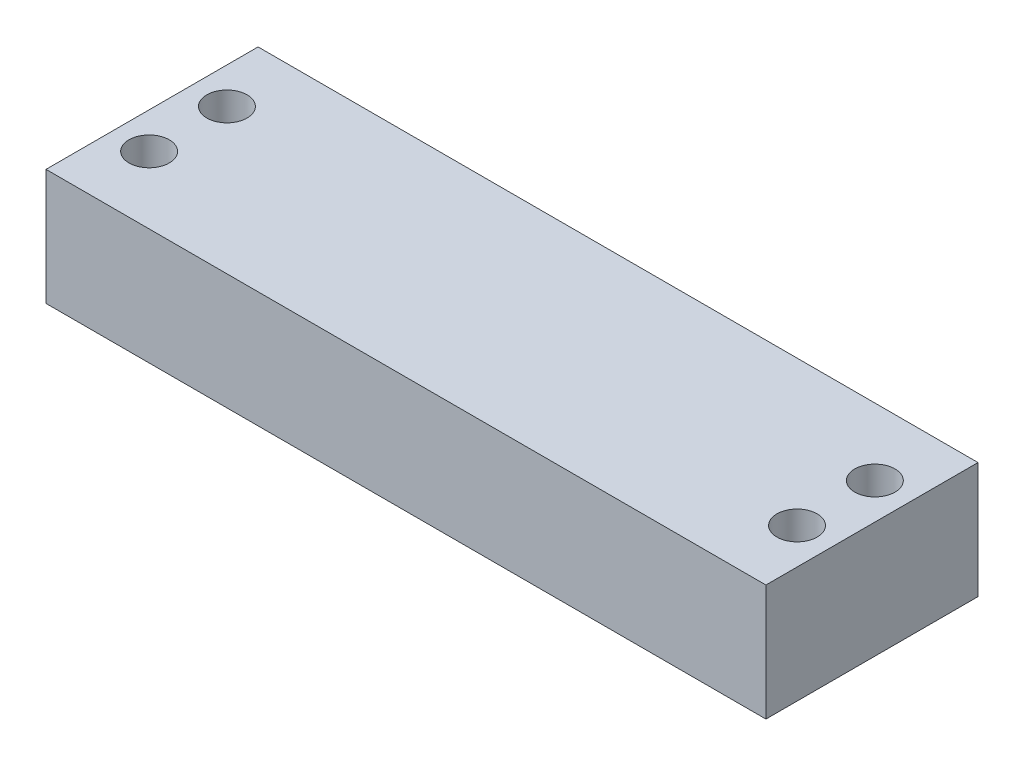
ISO-10303-21;
HEADER;
FILE_DESCRIPTION(('STEP AP214'),'2;1');
FILE_NAME('part.step','',(''),(''),'','','');
FILE_SCHEMA(('AUTOMOTIVE_DESIGN { 1 0 10303 214 1 1 1 1 }'));
ENDSEC;
DATA;
#1=APPLICATION_CONTEXT('core data for automotive mechanical design processes');
#2=APPLICATION_PROTOCOL_DEFINITION('international standard','automotive_design',2000,#1);
#3=PRODUCT_CONTEXT('',#1,'mechanical');
#4=PRODUCT('Part','Part','',(#3));
#5=PRODUCT_RELATED_PRODUCT_CATEGORY('part','',(#4));
#6=PRODUCT_DEFINITION_FORMATION('','',#4);
#7=PRODUCT_DEFINITION_CONTEXT('part definition',#1,'design');
#8=PRODUCT_DEFINITION('design','',#6,#7);
#9=PRODUCT_DEFINITION_SHAPE('','',#8);
#10=(LENGTH_UNIT() NAMED_UNIT(*) SI_UNIT(.MILLI.,.METRE.));
#11=(NAMED_UNIT(*) PLANE_ANGLE_UNIT() SI_UNIT($,.RADIAN.));
#12=(NAMED_UNIT(*) SI_UNIT($,.STERADIAN.) SOLID_ANGLE_UNIT());
#13=UNCERTAINTY_MEASURE_WITH_UNIT(LENGTH_MEASURE(1.E-05),#10,'distance_accuracy_value','');
#14=(GEOMETRIC_REPRESENTATION_CONTEXT(3) GLOBAL_UNCERTAINTY_ASSIGNED_CONTEXT((#13)) GLOBAL_UNIT_ASSIGNED_CONTEXT((#10,
#11,#12)) REPRESENTATION_CONTEXT('',''));
#15=CARTESIAN_POINT('',(0.,0.,0.));
#16=DIRECTION('',(0.,0.,1.));
#17=DIRECTION('',(1.,0.,0.));
#18=AXIS2_PLACEMENT_3D('',#15,#16,#17);
#19=CARTESIAN_POINT('',(0.,11.938,0.));
#20=DIRECTION('',(0.,-1.,0.));
#21=DIRECTION('',(0.,0.,-1.));
#22=AXIS2_PLACEMENT_3D('',#19,#20,#21);
#23=PLANE('',#22);
#24=DIRECTION('',(0.,0.,1.));
#25=VECTOR('',#24,1.);
#26=CARTESIAN_POINT('',(0.,11.938,0.));
#27=LINE('',#26,#25);
#28=CARTESIAN_POINT('',(0.,11.938,-21.8));
#29=VERTEX_POINT('',#28);
#30=CARTESIAN_POINT('',(0.,11.938,0.));
#31=VERTEX_POINT('',#30);
#32=EDGE_CURVE('E84',#29,#31,#27,.T.);
#33=ORIENTED_EDGE('',*,*,#32,.T.);
#34=DIRECTION('',(1.,0.,0.));
#35=VECTOR('',#34,1.);
#36=CARTESIAN_POINT('',(0.,11.938,0.));
#37=LINE('',#36,#35);
#38=CARTESIAN_POINT('',(74.,11.938,0.));
#39=VERTEX_POINT('',#38);
#40=EDGE_CURVE('E79',#31,#39,#37,.T.);
#41=ORIENTED_EDGE('',*,*,#40,.T.);
#42=DIRECTION('',(0.,0.,-1.));
#43=VECTOR('',#42,1.);
#44=CARTESIAN_POINT('',(74.,11.938,0.));
#45=LINE('',#44,#43);
#46=CARTESIAN_POINT('',(74.,11.938,-21.8));
#47=VERTEX_POINT('',#46);
#48=EDGE_CURVE('E82',#39,#47,#45,.T.);
#49=ORIENTED_EDGE('',*,*,#48,.T.);
#50=DIRECTION('',(-1.,0.,0.));
#51=VECTOR('',#50,1.);
#52=CARTESIAN_POINT('',(0.,11.938,-21.8));
#53=LINE('',#52,#51);
#54=EDGE_CURVE('E49',#47,#29,#53,.T.);
#55=ORIENTED_EDGE('',*,*,#54,.T.);
#56=EDGE_LOOP('',(#33,#41,#49,#55));
#57=FACE_BOUND('',#56,.T.);
#58=CARTESIAN_POINT('',(3.7,11.938,-6.9));
#59=DIRECTION('',(0.,1.,0.));
#60=DIRECTION('',(0.,0.,1.));
#61=AXIS2_PLACEMENT_3D('',#58,#59,#60);
#62=CIRCLE('',#61,2.0701);
#63=CARTESIAN_POINT('',(3.7,11.938,-4.8299));
#64=VERTEX_POINT('',#63);
#65=EDGE_CURVE('E99',#64,#64,#62,.T.);
#66=ORIENTED_EDGE('',*,*,#65,.F.);
#67=EDGE_LOOP('',(#66));
#68=FACE_BOUND('',#67,.T.);
#69=CARTESIAN_POINT('',(3.7,11.938,-14.9));
#70=DIRECTION('',(0.,1.,0.));
#71=DIRECTION('',(0.,0.,-1.));
#72=AXIS2_PLACEMENT_3D('',#69,#70,#71);
#73=CIRCLE('',#72,2.0701);
#74=CARTESIAN_POINT('',(3.7,11.938,-16.9701));
#75=VERTEX_POINT('',#74);
#76=EDGE_CURVE('E114',#75,#75,#73,.T.);
#77=ORIENTED_EDGE('',*,*,#76,.F.);
#78=EDGE_LOOP('',(#77));
#79=FACE_BOUND('',#78,.T.);
#80=CARTESIAN_POINT('',(70.3,11.938,-6.9));
#81=DIRECTION('',(0.,1.,0.));
#82=DIRECTION('',(0.,0.,-1.));
#83=AXIS2_PLACEMENT_3D('',#80,#81,#82);
#84=CIRCLE('',#83,2.0701);
#85=CARTESIAN_POINT('',(70.3,11.938,-8.9701));
#86=VERTEX_POINT('',#85);
#87=EDGE_CURVE('E120',#86,#86,#84,.T.);
#88=ORIENTED_EDGE('',*,*,#87,.F.);
#89=EDGE_LOOP('',(#88));
#90=FACE_BOUND('',#89,.T.);
#91=CARTESIAN_POINT('',(70.3,11.938,-14.9));
#92=DIRECTION('',(0.,1.,0.));
#93=DIRECTION('',(0.,0.,1.));
#94=AXIS2_PLACEMENT_3D('',#91,#92,#93);
#95=CIRCLE('',#94,2.0701);
#96=CARTESIAN_POINT('',(70.3,11.938,-12.8299));
#97=VERTEX_POINT('',#96);
#98=EDGE_CURVE('E126',#97,#97,#95,.T.);
#99=ORIENTED_EDGE('',*,*,#98,.F.);
#100=EDGE_LOOP('',(#99));
#101=FACE_BOUND('',#100,.T.);
#102=ADVANCED_FACE('F32',(#57,#68,#79,#90,#101),#23,.F.);
#103=CARTESIAN_POINT('',(0.,0.,0.));
#104=DIRECTION('',(0.,-1.,0.));
#105=DIRECTION('',(0.,0.,-1.));
#106=AXIS2_PLACEMENT_3D('',#103,#104,#105);
#107=PLANE('',#106);
#108=CARTESIAN_POINT('',(70.3,0.,-6.9));
#109=DIRECTION('',(0.,1.,0.));
#110=DIRECTION('',(0.,0.,-1.));
#111=AXIS2_PLACEMENT_3D('',#108,#109,#110);
#112=CIRCLE('',#111,2.0701);
#113=CARTESIAN_POINT('',(70.3,0.,-8.9701));
#114=VERTEX_POINT('',#113);
#115=EDGE_CURVE('E123',#114,#114,#112,.T.);
#116=ORIENTED_EDGE('',*,*,#115,.T.);
#117=EDGE_LOOP('',(#116));
#118=FACE_BOUND('',#117,.T.);
#119=CARTESIAN_POINT('',(3.7,0.,-6.9));
#120=DIRECTION('',(0.,1.,0.));
#121=DIRECTION('',(0.,0.,1.));
#122=AXIS2_PLACEMENT_3D('',#119,#120,#121);
#123=CIRCLE('',#122,2.0701);
#124=CARTESIAN_POINT('',(3.7,0.,-4.8299));
#125=VERTEX_POINT('',#124);
#126=EDGE_CURVE('E111',#125,#125,#123,.T.);
#127=ORIENTED_EDGE('',*,*,#126,.T.);
#128=EDGE_LOOP('',(#127));
#129=FACE_BOUND('',#128,.T.);
#130=DIRECTION('',(0.,0.,1.));
#131=VECTOR('',#130,1.);
#132=CARTESIAN_POINT('',(0.,0.,0.));
#133=LINE('',#132,#131);
#134=CARTESIAN_POINT('',(0.,0.,-21.8));
#135=VERTEX_POINT('',#134);
#136=CARTESIAN_POINT('',(0.,0.,0.));
#137=VERTEX_POINT('',#136);
#138=EDGE_CURVE('E96',#135,#137,#133,.T.);
#139=ORIENTED_EDGE('',*,*,#138,.F.);
#140=DIRECTION('',(-1.,0.,0.));
#141=VECTOR('',#140,1.);
#142=CARTESIAN_POINT('',(0.,0.,-21.8));
#143=LINE('',#142,#141);
#144=CARTESIAN_POINT('',(74.,0.,-21.8));
#145=VERTEX_POINT('',#144);
#146=EDGE_CURVE('E72',#145,#135,#143,.T.);
#147=ORIENTED_EDGE('',*,*,#146,.F.);
#148=DIRECTION('',(0.,0.,-1.));
#149=VECTOR('',#148,1.);
#150=CARTESIAN_POINT('',(74.,0.,0.));
#151=LINE('',#150,#149);
#152=CARTESIAN_POINT('',(74.,0.,0.));
#153=VERTEX_POINT('',#152);
#154=EDGE_CURVE('E66',#153,#145,#151,.T.);
#155=ORIENTED_EDGE('',*,*,#154,.F.);
#156=DIRECTION('',(1.,0.,0.));
#157=VECTOR('',#156,1.);
#158=CARTESIAN_POINT('',(0.,0.,0.));
#159=LINE('',#158,#157);
#160=EDGE_CURVE('E88',#137,#153,#159,.T.);
#161=ORIENTED_EDGE('',*,*,#160,.F.);
#162=EDGE_LOOP('',(#139,#147,#155,#161));
#163=FACE_BOUND('',#162,.T.);
#164=CARTESIAN_POINT('',(3.7,0.,-14.9));
#165=DIRECTION('',(0.,1.,0.));
#166=DIRECTION('',(0.,0.,-1.));
#167=AXIS2_PLACEMENT_3D('',#164,#165,#166);
#168=CIRCLE('',#167,2.0701);
#169=CARTESIAN_POINT('',(3.7,0.,-16.9701));
#170=VERTEX_POINT('',#169);
#171=EDGE_CURVE('E117',#170,#170,#168,.T.);
#172=ORIENTED_EDGE('',*,*,#171,.T.);
#173=EDGE_LOOP('',(#172));
#174=FACE_BOUND('',#173,.T.);
#175=CARTESIAN_POINT('',(70.3,0.,-14.9));
#176=DIRECTION('',(0.,1.,0.));
#177=DIRECTION('',(0.,0.,1.));
#178=AXIS2_PLACEMENT_3D('',#175,#176,#177);
#179=CIRCLE('',#178,2.0701);
#180=CARTESIAN_POINT('',(70.3,0.,-12.8299));
#181=VERTEX_POINT('',#180);
#182=EDGE_CURVE('E129',#181,#181,#179,.T.);
#183=ORIENTED_EDGE('',*,*,#182,.T.);
#184=EDGE_LOOP('',(#183));
#185=FACE_BOUND('',#184,.T.);
#186=ADVANCED_FACE('F107',(#118,#129,#163,#174,#185),#107,.T.);
#187=CARTESIAN_POINT('',(0.,11.938,0.));
#188=DIRECTION('',(1.,0.,0.));
#189=DIRECTION('',(0.,0.,-1.));
#190=AXIS2_PLACEMENT_3D('',#187,#188,#189);
#191=PLANE('',#190);
#192=ORIENTED_EDGE('',*,*,#138,.T.);
#193=DIRECTION('',(0.,-1.,0.));
#194=VECTOR('',#193,1.);
#195=CARTESIAN_POINT('',(0.,11.938,0.));
#196=LINE('',#195,#194);
#197=EDGE_CURVE('E11',#31,#137,#196,.T.);
#198=ORIENTED_EDGE('',*,*,#197,.F.);
#199=ORIENTED_EDGE('',*,*,#32,.F.);
#200=DIRECTION('',(0.,-1.,0.));
#201=VECTOR('',#200,1.);
#202=CARTESIAN_POINT('',(0.,11.938,-21.8));
#203=LINE('',#202,#201);
#204=EDGE_CURVE('E92',#29,#135,#203,.T.);
#205=ORIENTED_EDGE('',*,*,#204,.T.);
#206=EDGE_LOOP('',(#192,#198,#199,#205));
#207=FACE_BOUND('',#206,.T.);
#208=ADVANCED_FACE('F34',(#207),#191,.F.);
#209=CARTESIAN_POINT('',(0.,11.938,0.));
#210=DIRECTION('',(0.,0.,-1.));
#211=DIRECTION('',(-1.,0.,0.));
#212=AXIS2_PLACEMENT_3D('',#209,#210,#211);
#213=PLANE('',#212);
#214=ORIENTED_EDGE('',*,*,#160,.T.);
#215=DIRECTION('',(0.,-1.,0.));
#216=VECTOR('',#215,1.);
#217=CARTESIAN_POINT('',(74.,11.938,0.));
#218=LINE('',#217,#216);
#219=EDGE_CURVE('E41',#39,#153,#218,.T.);
#220=ORIENTED_EDGE('',*,*,#219,.F.);
#221=ORIENTED_EDGE('',*,*,#40,.F.);
#222=ORIENTED_EDGE('',*,*,#197,.T.);
#223=EDGE_LOOP('',(#214,#220,#221,#222));
#224=FACE_BOUND('',#223,.T.);
#225=ADVANCED_FACE('F87',(#224),#213,.F.);
#226=CARTESIAN_POINT('',(74.,11.938,0.));
#227=DIRECTION('',(-1.,0.,0.));
#228=DIRECTION('',(0.,0.,1.));
#229=AXIS2_PLACEMENT_3D('',#226,#227,#228);
#230=PLANE('',#229);
#231=ORIENTED_EDGE('',*,*,#154,.T.);
#232=DIRECTION('',(0.,-1.,0.));
#233=VECTOR('',#232,1.);
#234=CARTESIAN_POINT('',(74.,11.938,-21.8));
#235=LINE('',#234,#233);
#236=EDGE_CURVE('E89',#47,#145,#235,.T.);
#237=ORIENTED_EDGE('',*,*,#236,.F.);
#238=ORIENTED_EDGE('',*,*,#48,.F.);
#239=ORIENTED_EDGE('',*,*,#219,.T.);
#240=EDGE_LOOP('',(#231,#237,#238,#239));
#241=FACE_BOUND('',#240,.T.);
#242=ADVANCED_FACE('F90',(#241),#230,.F.);
#243=CARTESIAN_POINT('',(0.,11.938,-21.8));
#244=DIRECTION('',(0.,0.,1.));
#245=DIRECTION('',(1.,0.,0.));
#246=AXIS2_PLACEMENT_3D('',#243,#244,#245);
#247=PLANE('',#246);
#248=ORIENTED_EDGE('',*,*,#146,.T.);
#249=ORIENTED_EDGE('',*,*,#204,.F.);
#250=ORIENTED_EDGE('',*,*,#54,.F.);
#251=ORIENTED_EDGE('',*,*,#236,.T.);
#252=EDGE_LOOP('',(#248,#249,#250,#251));
#253=FACE_BOUND('',#252,.T.);
#254=ADVANCED_FACE('F104',(#253),#247,.F.);
#255=CARTESIAN_POINT('',(3.7,11.938,-6.9));
#256=DIRECTION('',(0.,-1.,0.));
#257=DIRECTION('',(0.,0.,-1.));
#258=AXIS2_PLACEMENT_3D('',#255,#256,#257);
#259=CYLINDRICAL_SURFACE('',#258,2.0701);
#260=ORIENTED_EDGE('',*,*,#65,.T.);
#261=EDGE_LOOP('',(#260));
#262=FACE_BOUND('',#261,.T.);
#263=ORIENTED_EDGE('',*,*,#126,.F.);
#264=EDGE_LOOP('',(#263));
#265=FACE_BOUND('',#264,.T.);
#266=ADVANCED_FACE('F146',(#262,#265),#259,.F.);
#267=CARTESIAN_POINT('',(3.7,11.938,-14.9));
#268=DIRECTION('',(0.,-1.,0.));
#269=DIRECTION('',(0.,0.,-1.));
#270=AXIS2_PLACEMENT_3D('',#267,#268,#269);
#271=CYLINDRICAL_SURFACE('',#270,2.0701);
#272=ORIENTED_EDGE('',*,*,#76,.T.);
#273=EDGE_LOOP('',(#272));
#274=FACE_BOUND('',#273,.T.);
#275=ORIENTED_EDGE('',*,*,#171,.F.);
#276=EDGE_LOOP('',(#275));
#277=FACE_BOUND('',#276,.T.);
#278=ADVANCED_FACE('F192',(#274,#277),#271,.F.);
#279=CARTESIAN_POINT('',(70.3,11.938,-6.9));
#280=DIRECTION('',(0.,-1.,0.));
#281=DIRECTION('',(0.,0.,-1.));
#282=AXIS2_PLACEMENT_3D('',#279,#280,#281);
#283=CYLINDRICAL_SURFACE('',#282,2.0701);
#284=ORIENTED_EDGE('',*,*,#87,.T.);
#285=EDGE_LOOP('',(#284));
#286=FACE_BOUND('',#285,.T.);
#287=ORIENTED_EDGE('',*,*,#115,.F.);
#288=EDGE_LOOP('',(#287));
#289=FACE_BOUND('',#288,.T.);
#290=ADVANCED_FACE('F200',(#286,#289),#283,.F.);
#291=CARTESIAN_POINT('',(70.3,11.938,-14.9));
#292=DIRECTION('',(0.,-1.,0.));
#293=DIRECTION('',(0.,0.,-1.));
#294=AXIS2_PLACEMENT_3D('',#291,#292,#293);
#295=CYLINDRICAL_SURFACE('',#294,2.0701);
#296=ORIENTED_EDGE('',*,*,#98,.T.);
#297=EDGE_LOOP('',(#296));
#298=FACE_BOUND('',#297,.T.);
#299=ORIENTED_EDGE('',*,*,#182,.F.);
#300=EDGE_LOOP('',(#299));
#301=FACE_BOUND('',#300,.T.);
#302=ADVANCED_FACE('F135',(#298,#301),#295,.F.);
#303=CLOSED_SHELL('',(#102,#186,#208,#225,#242,#254,#266,#278,#290,#302));
#304=MANIFOLD_SOLID_BREP('B2',#303);
#305=ADVANCED_BREP_SHAPE_REPRESENTATION('',(#18,#304),#14);
#306=SHAPE_DEFINITION_REPRESENTATION(#9,#305);
ENDSEC;
END-ISO-10303-21;
